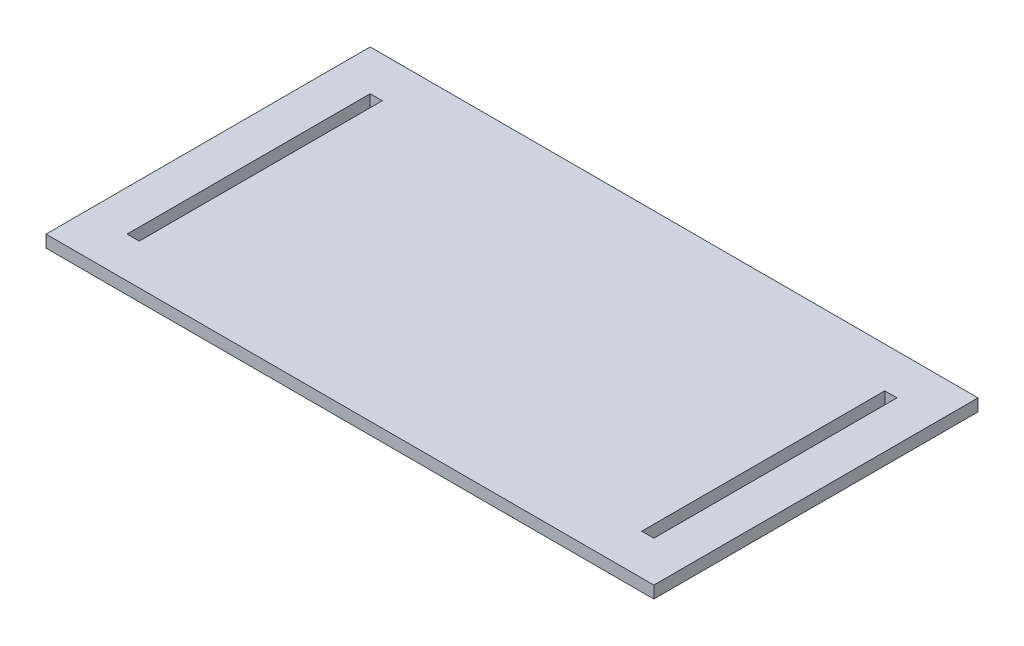
ISO-10303-21;
HEADER;
FILE_DESCRIPTION(('STEP AP214'),'2;1');
FILE_NAME('part.step','',(''),(''),'','','');
FILE_SCHEMA(('AUTOMOTIVE_DESIGN { 1 0 10303 214 1 1 1 1 }'));
ENDSEC;
DATA;
#1=APPLICATION_CONTEXT('core data for automotive mechanical design processes');
#2=APPLICATION_PROTOCOL_DEFINITION('international standard','automotive_design',2000,#1);
#3=PRODUCT_CONTEXT('',#1,'mechanical');
#4=PRODUCT('Part','Part','',(#3));
#5=PRODUCT_RELATED_PRODUCT_CATEGORY('part','',(#4));
#6=PRODUCT_DEFINITION_FORMATION('','',#4);
#7=PRODUCT_DEFINITION_CONTEXT('part definition',#1,'design');
#8=PRODUCT_DEFINITION('design','',#6,#7);
#9=PRODUCT_DEFINITION_SHAPE('','',#8);
#10=(LENGTH_UNIT() NAMED_UNIT(*) SI_UNIT(.MILLI.,.METRE.));
#11=(NAMED_UNIT(*) PLANE_ANGLE_UNIT() SI_UNIT($,.RADIAN.));
#12=(NAMED_UNIT(*) SI_UNIT($,.STERADIAN.) SOLID_ANGLE_UNIT());
#13=UNCERTAINTY_MEASURE_WITH_UNIT(LENGTH_MEASURE(1.E-05),#10,'distance_accuracy_value','');
#14=(GEOMETRIC_REPRESENTATION_CONTEXT(3) GLOBAL_UNCERTAINTY_ASSIGNED_CONTEXT((#13)) GLOBAL_UNIT_ASSIGNED_CONTEXT((#10,
#11,#12)) REPRESENTATION_CONTEXT('',''));
#15=CARTESIAN_POINT('',(0.,0.,0.));
#16=DIRECTION('',(0.,0.,1.));
#17=DIRECTION('',(1.,0.,0.));
#18=AXIS2_PLACEMENT_3D('',#15,#16,#17);
#19=CARTESIAN_POINT('',(0.,3.,0.));
#20=DIRECTION('',(0.,-1.,0.));
#21=DIRECTION('',(0.,0.,-1.));
#22=AXIS2_PLACEMENT_3D('',#19,#20,#21);
#23=PLANE('',#22);
#24=DIRECTION('',(1.,0.,0.));
#25=VECTOR('',#24,1.);
#26=CARTESIAN_POINT('',(0.,3.,-70.));
#27=LINE('',#26,#25);
#28=CARTESIAN_POINT('',(10.,3.,-70.));
#29=VERTEX_POINT('',#28);
#30=CARTESIAN_POINT('',(13.,3.,-70.));
#31=VERTEX_POINT('',#30);
#32=EDGE_CURVE('E193',#29,#31,#27,.T.);
#33=ORIENTED_EDGE('',*,*,#32,.T.);
#34=DIRECTION('',(0.,0.,1.));
#35=VECTOR('',#34,1.);
#36=CARTESIAN_POINT('',(13.,3.,0.));
#37=LINE('',#36,#35);
#38=CARTESIAN_POINT('',(13.,3.,-10.));
#39=VERTEX_POINT('',#38);
#40=EDGE_CURVE('E134',#31,#39,#37,.T.);
#41=ORIENTED_EDGE('',*,*,#40,.T.);
#42=DIRECTION('',(1.,0.,0.));
#43=VECTOR('',#42,1.);
#44=CARTESIAN_POINT('',(0.,3.,-10.));
#45=LINE('',#44,#43);
#46=CARTESIAN_POINT('',(10.,3.,-10.));
#47=VERTEX_POINT('',#46);
#48=EDGE_CURVE('E189',#47,#39,#45,.T.);
#49=ORIENTED_EDGE('',*,*,#48,.F.);
#50=DIRECTION('',(0.,0.,1.));
#51=VECTOR('',#50,1.);
#52=CARTESIAN_POINT('',(10.,3.,0.));
#53=LINE('',#52,#51);
#54=EDGE_CURVE('E191',#29,#47,#53,.T.);
#55=ORIENTED_EDGE('',*,*,#54,.F.);
#56=EDGE_LOOP('',(#33,#41,#49,#55));
#57=FACE_BOUND('',#56,.T.);
#58=DIRECTION('',(0.,0.,1.));
#59=VECTOR('',#58,1.);
#60=CARTESIAN_POINT('',(0.,3.,0.));
#61=LINE('',#60,#59);
#62=CARTESIAN_POINT('',(0.,3.,-80.));
#63=VERTEX_POINT('',#62);
#64=CARTESIAN_POINT('',(0.,3.,0.));
#65=VERTEX_POINT('',#64);
#66=EDGE_CURVE('E197',#63,#65,#61,.T.);
#67=ORIENTED_EDGE('',*,*,#66,.T.);
#68=DIRECTION('',(1.,0.,0.));
#69=VECTOR('',#68,1.);
#70=CARTESIAN_POINT('',(0.,3.,0.));
#71=LINE('',#70,#69);
#72=CARTESIAN_POINT('',(150.,3.,0.));
#73=VERTEX_POINT('',#72);
#74=EDGE_CURVE('E200',#65,#73,#71,.T.);
#75=ORIENTED_EDGE('',*,*,#74,.T.);
#76=DIRECTION('',(0.,0.,-1.));
#77=VECTOR('',#76,1.);
#78=CARTESIAN_POINT('',(150.,3.,0.));
#79=LINE('',#78,#77);
#80=CARTESIAN_POINT('',(150.,3.,-80.));
#81=VERTEX_POINT('',#80);
#82=EDGE_CURVE('E203',#73,#81,#79,.T.);
#83=ORIENTED_EDGE('',*,*,#82,.T.);
#84=DIRECTION('',(-1.,0.,0.));
#85=VECTOR('',#84,1.);
#86=CARTESIAN_POINT('',(0.,3.,-80.));
#87=LINE('',#86,#85);
#88=EDGE_CURVE('E205',#81,#63,#87,.T.);
#89=ORIENTED_EDGE('',*,*,#88,.T.);
#90=EDGE_LOOP('',(#67,#75,#83,#89));
#91=FACE_BOUND('',#90,.T.);
#92=DIRECTION('',(-1.,0.,0.));
#93=VECTOR('',#92,1.);
#94=CARTESIAN_POINT('',(0.,3.,-70.));
#95=LINE('',#94,#93);
#96=CARTESIAN_POINT('',(140.,3.,-70.));
#97=VERTEX_POINT('',#96);
#98=CARTESIAN_POINT('',(137.,3.,-70.));
#99=VERTEX_POINT('',#98);
#100=EDGE_CURVE('E187',#97,#99,#95,.T.);
#101=ORIENTED_EDGE('',*,*,#100,.F.);
#102=DIRECTION('',(0.,0.,1.));
#103=VECTOR('',#102,1.);
#104=CARTESIAN_POINT('',(140.,3.,0.));
#105=LINE('',#104,#103);
#106=CARTESIAN_POINT('',(140.,3.,-10.));
#107=VERTEX_POINT('',#106);
#108=EDGE_CURVE('E137',#97,#107,#105,.T.);
#109=ORIENTED_EDGE('',*,*,#108,.T.);
#110=DIRECTION('',(-1.,0.,0.));
#111=VECTOR('',#110,1.);
#112=CARTESIAN_POINT('',(0.,3.,-10.));
#113=LINE('',#112,#111);
#114=CARTESIAN_POINT('',(137.,3.,-10.));
#115=VERTEX_POINT('',#114);
#116=EDGE_CURVE('E182',#107,#115,#113,.T.);
#117=ORIENTED_EDGE('',*,*,#116,.T.);
#118=DIRECTION('',(0.,0.,1.));
#119=VECTOR('',#118,1.);
#120=CARTESIAN_POINT('',(137.,3.,0.));
#121=LINE('',#120,#119);
#122=EDGE_CURVE('E185',#99,#115,#121,.T.);
#123=ORIENTED_EDGE('',*,*,#122,.F.);
#124=EDGE_LOOP('',(#101,#109,#117,#123));
#125=FACE_BOUND('',#124,.T.);
#126=ADVANCED_FACE('F38',(#57,#91,#125),#23,.F.);
#127=CARTESIAN_POINT('',(0.,0.,0.));
#128=DIRECTION('',(0.,-1.,0.));
#129=DIRECTION('',(0.,0.,-1.));
#130=AXIS2_PLACEMENT_3D('',#127,#128,#129);
#131=PLANE('',#130);
#132=DIRECTION('',(0.,0.,1.));
#133=VECTOR('',#132,1.);
#134=CARTESIAN_POINT('',(13.,0.,0.));
#135=LINE('',#134,#133);
#136=CARTESIAN_POINT('',(13.,0.,-70.));
#137=VERTEX_POINT('',#136);
#138=CARTESIAN_POINT('',(13.,0.,-10.));
#139=VERTEX_POINT('',#138);
#140=EDGE_CURVE('E131',#137,#139,#135,.T.);
#141=ORIENTED_EDGE('',*,*,#140,.F.);
#142=DIRECTION('',(1.,0.,0.));
#143=VECTOR('',#142,1.);
#144=CARTESIAN_POINT('',(0.,0.,-70.));
#145=LINE('',#144,#143);
#146=CARTESIAN_POINT('',(10.,0.,-70.));
#147=VERTEX_POINT('',#146);
#148=EDGE_CURVE('E141',#147,#137,#145,.T.);
#149=ORIENTED_EDGE('',*,*,#148,.F.);
#150=DIRECTION('',(0.,0.,1.));
#151=VECTOR('',#150,1.);
#152=CARTESIAN_POINT('',(10.,0.,0.));
#153=LINE('',#152,#151);
#154=CARTESIAN_POINT('',(10.,0.,-10.));
#155=VERTEX_POINT('',#154);
#156=EDGE_CURVE('E147',#147,#155,#153,.T.);
#157=ORIENTED_EDGE('',*,*,#156,.T.);
#158=DIRECTION('',(1.,0.,0.));
#159=VECTOR('',#158,1.);
#160=CARTESIAN_POINT('',(0.,0.,-10.));
#161=LINE('',#160,#159);
#162=EDGE_CURVE('E152',#155,#139,#161,.T.);
#163=ORIENTED_EDGE('',*,*,#162,.T.);
#164=EDGE_LOOP('',(#141,#149,#157,#163));
#165=FACE_BOUND('',#164,.T.);
#166=DIRECTION('',(0.,0.,1.));
#167=VECTOR('',#166,1.);
#168=CARTESIAN_POINT('',(0.,0.,0.));
#169=LINE('',#168,#167);
#170=CARTESIAN_POINT('',(0.,0.,-80.));
#171=VERTEX_POINT('',#170);
#172=CARTESIAN_POINT('',(0.,0.,0.));
#173=VERTEX_POINT('',#172);
#174=EDGE_CURVE('E196',#171,#173,#169,.T.);
#175=ORIENTED_EDGE('',*,*,#174,.F.);
#176=DIRECTION('',(-1.,0.,0.));
#177=VECTOR('',#176,1.);
#178=CARTESIAN_POINT('',(0.,0.,-80.));
#179=LINE('',#178,#177);
#180=CARTESIAN_POINT('',(150.,0.,-80.));
#181=VERTEX_POINT('',#180);
#182=EDGE_CURVE('E201',#181,#171,#179,.T.);
#183=ORIENTED_EDGE('',*,*,#182,.F.);
#184=DIRECTION('',(0.,0.,-1.));
#185=VECTOR('',#184,1.);
#186=CARTESIAN_POINT('',(150.,0.,0.));
#187=LINE('',#186,#185);
#188=CARTESIAN_POINT('',(150.,0.,0.));
#189=VERTEX_POINT('',#188);
#190=EDGE_CURVE('E212',#189,#181,#187,.T.);
#191=ORIENTED_EDGE('',*,*,#190,.F.);
#192=DIRECTION('',(1.,0.,0.));
#193=VECTOR('',#192,1.);
#194=CARTESIAN_POINT('',(0.,0.,0.));
#195=LINE('',#194,#193);
#196=EDGE_CURVE('E210',#173,#189,#195,.T.);
#197=ORIENTED_EDGE('',*,*,#196,.F.);
#198=EDGE_LOOP('',(#175,#183,#191,#197));
#199=FACE_BOUND('',#198,.T.);
#200=DIRECTION('',(0.,0.,1.));
#201=VECTOR('',#200,1.);
#202=CARTESIAN_POINT('',(140.,0.,0.));
#203=LINE('',#202,#201);
#204=CARTESIAN_POINT('',(140.,0.,-70.));
#205=VERTEX_POINT('',#204);
#206=CARTESIAN_POINT('',(140.,0.,-10.));
#207=VERTEX_POINT('',#206);
#208=EDGE_CURVE('E173',#205,#207,#203,.T.);
#209=ORIENTED_EDGE('',*,*,#208,.F.);
#210=DIRECTION('',(-1.,0.,0.));
#211=VECTOR('',#210,1.);
#212=CARTESIAN_POINT('',(0.,0.,-70.));
#213=LINE('',#212,#211);
#214=CARTESIAN_POINT('',(137.,0.,-70.));
#215=VERTEX_POINT('',#214);
#216=EDGE_CURVE('E164',#205,#215,#213,.T.);
#217=ORIENTED_EDGE('',*,*,#216,.T.);
#218=DIRECTION('',(0.,0.,1.));
#219=VECTOR('',#218,1.);
#220=CARTESIAN_POINT('',(137.,0.,0.));
#221=LINE('',#220,#219);
#222=CARTESIAN_POINT('',(137.,0.,-10.));
#223=VERTEX_POINT('',#222);
#224=EDGE_CURVE('E167',#215,#223,#221,.T.);
#225=ORIENTED_EDGE('',*,*,#224,.T.);
#226=DIRECTION('',(-1.,0.,0.));
#227=VECTOR('',#226,1.);
#228=CARTESIAN_POINT('',(0.,0.,-10.));
#229=LINE('',#228,#227);
#230=EDGE_CURVE('E170',#207,#223,#229,.T.);
#231=ORIENTED_EDGE('',*,*,#230,.F.);
#232=EDGE_LOOP('',(#209,#217,#225,#231));
#233=FACE_BOUND('',#232,.T.);
#234=ADVANCED_FACE('F150',(#165,#199,#233),#131,.T.);
#235=CARTESIAN_POINT('',(0.,3.,0.));
#236=DIRECTION('',(1.,0.,0.));
#237=DIRECTION('',(0.,0.,-1.));
#238=AXIS2_PLACEMENT_3D('',#235,#236,#237);
#239=PLANE('',#238);
#240=ORIENTED_EDGE('',*,*,#174,.T.);
#241=DIRECTION('',(0.,-1.,0.));
#242=VECTOR('',#241,1.);
#243=CARTESIAN_POINT('',(0.,3.,0.));
#244=LINE('',#243,#242);
#245=EDGE_CURVE('E11',#65,#173,#244,.T.);
#246=ORIENTED_EDGE('',*,*,#245,.F.);
#247=ORIENTED_EDGE('',*,*,#66,.F.);
#248=DIRECTION('',(0.,-1.,0.));
#249=VECTOR('',#248,1.);
#250=CARTESIAN_POINT('',(0.,3.,-80.));
#251=LINE('',#250,#249);
#252=EDGE_CURVE('E207',#63,#171,#251,.T.);
#253=ORIENTED_EDGE('',*,*,#252,.T.);
#254=EDGE_LOOP('',(#240,#246,#247,#253));
#255=FACE_BOUND('',#254,.T.);
#256=ADVANCED_FACE('F40',(#255),#239,.F.);
#257=CARTESIAN_POINT('',(0.,3.,0.));
#258=DIRECTION('',(0.,0.,-1.));
#259=DIRECTION('',(-1.,0.,0.));
#260=AXIS2_PLACEMENT_3D('',#257,#258,#259);
#261=PLANE('',#260);
#262=ORIENTED_EDGE('',*,*,#196,.T.);
#263=DIRECTION('',(0.,-1.,0.));
#264=VECTOR('',#263,1.);
#265=CARTESIAN_POINT('',(150.,3.,0.));
#266=LINE('',#265,#264);
#267=EDGE_CURVE('E46',#73,#189,#266,.T.);
#268=ORIENTED_EDGE('',*,*,#267,.F.);
#269=ORIENTED_EDGE('',*,*,#74,.F.);
#270=ORIENTED_EDGE('',*,*,#245,.T.);
#271=EDGE_LOOP('',(#262,#268,#269,#270));
#272=FACE_BOUND('',#271,.T.);
#273=ADVANCED_FACE('F239',(#272),#261,.F.);
#274=CARTESIAN_POINT('',(150.,3.,0.));
#275=DIRECTION('',(-1.,0.,0.));
#276=DIRECTION('',(0.,0.,1.));
#277=AXIS2_PLACEMENT_3D('',#274,#275,#276);
#278=PLANE('',#277);
#279=ORIENTED_EDGE('',*,*,#190,.T.);
#280=DIRECTION('',(0.,-1.,0.));
#281=VECTOR('',#280,1.);
#282=CARTESIAN_POINT('',(150.,3.,-80.));
#283=LINE('',#282,#281);
#284=EDGE_CURVE('E217',#81,#181,#283,.T.);
#285=ORIENTED_EDGE('',*,*,#284,.F.);
#286=ORIENTED_EDGE('',*,*,#82,.F.);
#287=ORIENTED_EDGE('',*,*,#267,.T.);
#288=EDGE_LOOP('',(#279,#285,#286,#287));
#289=FACE_BOUND('',#288,.T.);
#290=ADVANCED_FACE('F224',(#289),#278,.F.);
#291=CARTESIAN_POINT('',(0.,3.,-80.));
#292=DIRECTION('',(0.,0.,1.));
#293=DIRECTION('',(1.,0.,0.));
#294=AXIS2_PLACEMENT_3D('',#291,#292,#293);
#295=PLANE('',#294);
#296=ORIENTED_EDGE('',*,*,#182,.T.);
#297=ORIENTED_EDGE('',*,*,#252,.F.);
#298=ORIENTED_EDGE('',*,*,#88,.F.);
#299=ORIENTED_EDGE('',*,*,#284,.T.);
#300=EDGE_LOOP('',(#296,#297,#298,#299));
#301=FACE_BOUND('',#300,.T.);
#302=ADVANCED_FACE('F232',(#301),#295,.F.);
#303=CARTESIAN_POINT('',(0.,10.,-70.));
#304=DIRECTION('',(0.,0.,1.));
#305=DIRECTION('',(1.,0.,0.));
#306=AXIS2_PLACEMENT_3D('',#303,#304,#305);
#307=PLANE('',#306);
#308=ORIENTED_EDGE('',*,*,#100,.T.);
#309=DIRECTION('',(0.,-1.,0.));
#310=VECTOR('',#309,1.);
#311=CARTESIAN_POINT('',(137.,10.,-70.));
#312=LINE('',#311,#310);
#313=EDGE_CURVE('E153',#99,#215,#312,.T.);
#314=ORIENTED_EDGE('',*,*,#313,.T.);
#315=ORIENTED_EDGE('',*,*,#216,.F.);
#316=DIRECTION('',(0.,-1.,0.));
#317=VECTOR('',#316,1.);
#318=CARTESIAN_POINT('',(140.,10.,-70.));
#319=LINE('',#318,#317);
#320=EDGE_CURVE('E175',#97,#205,#319,.T.);
#321=ORIENTED_EDGE('',*,*,#320,.F.);
#322=EDGE_LOOP('',(#308,#314,#315,#321));
#323=FACE_BOUND('',#322,.T.);
#324=ADVANCED_FACE('F255',(#323),#307,.T.);
#325=CARTESIAN_POINT('',(137.,10.,0.));
#326=DIRECTION('',(1.,0.,0.));
#327=DIRECTION('',(0.,0.,-1.));
#328=AXIS2_PLACEMENT_3D('',#325,#326,#327);
#329=PLANE('',#328);
#330=ORIENTED_EDGE('',*,*,#122,.T.);
#331=DIRECTION('',(0.,-1.,0.));
#332=VECTOR('',#331,1.);
#333=CARTESIAN_POINT('',(137.,10.,-10.));
#334=LINE('',#333,#332);
#335=EDGE_CURVE('E155',#115,#223,#334,.T.);
#336=ORIENTED_EDGE('',*,*,#335,.T.);
#337=ORIENTED_EDGE('',*,*,#224,.F.);
#338=ORIENTED_EDGE('',*,*,#313,.F.);
#339=EDGE_LOOP('',(#330,#336,#337,#338));
#340=FACE_BOUND('',#339,.T.);
#341=ADVANCED_FACE('F262',(#340),#329,.T.);
#342=CARTESIAN_POINT('',(0.,10.,-10.));
#343=DIRECTION('',(0.,0.,1.));
#344=DIRECTION('',(1.,0.,0.));
#345=AXIS2_PLACEMENT_3D('',#342,#343,#344);
#346=PLANE('',#345);
#347=DIRECTION('',(0.,-1.,0.));
#348=VECTOR('',#347,1.);
#349=CARTESIAN_POINT('',(140.,10.,-10.));
#350=LINE('',#349,#348);
#351=EDGE_CURVE('E61',#107,#207,#350,.T.);
#352=ORIENTED_EDGE('',*,*,#351,.T.);
#353=ORIENTED_EDGE('',*,*,#230,.T.);
#354=ORIENTED_EDGE('',*,*,#335,.F.);
#355=ORIENTED_EDGE('',*,*,#116,.F.);
#356=EDGE_LOOP('',(#352,#353,#354,#355));
#357=FACE_BOUND('',#356,.T.);
#358=ADVANCED_FACE('F268',(#357),#346,.F.);
#359=CARTESIAN_POINT('',(140.,10.,0.));
#360=DIRECTION('',(1.,0.,0.));
#361=DIRECTION('',(0.,0.,-1.));
#362=AXIS2_PLACEMENT_3D('',#359,#360,#361);
#363=PLANE('',#362);
#364=ORIENTED_EDGE('',*,*,#320,.T.);
#365=ORIENTED_EDGE('',*,*,#208,.T.);
#366=ORIENTED_EDGE('',*,*,#351,.F.);
#367=ORIENTED_EDGE('',*,*,#108,.F.);
#368=EDGE_LOOP('',(#364,#365,#366,#367));
#369=FACE_BOUND('',#368,.T.);
#370=ADVANCED_FACE('F279',(#369),#363,.F.);
#371=CARTESIAN_POINT('',(13.,10.,0.));
#372=DIRECTION('',(1.,0.,0.));
#373=DIRECTION('',(0.,0.,-1.));
#374=AXIS2_PLACEMENT_3D('',#371,#372,#373);
#375=PLANE('',#374);
#376=DIRECTION('',(0.,-1.,0.));
#377=VECTOR('',#376,1.);
#378=CARTESIAN_POINT('',(13.,10.,-70.));
#379=LINE('',#378,#377);
#380=EDGE_CURVE('E126',#31,#137,#379,.T.);
#381=ORIENTED_EDGE('',*,*,#380,.T.);
#382=ORIENTED_EDGE('',*,*,#140,.T.);
#383=DIRECTION('',(0.,-1.,0.));
#384=VECTOR('',#383,1.);
#385=CARTESIAN_POINT('',(13.,10.,-10.));
#386=LINE('',#385,#384);
#387=EDGE_CURVE('E160',#39,#139,#386,.T.);
#388=ORIENTED_EDGE('',*,*,#387,.F.);
#389=ORIENTED_EDGE('',*,*,#40,.F.);
#390=EDGE_LOOP('',(#381,#382,#388,#389));
#391=FACE_BOUND('',#390,.T.);
#392=ADVANCED_FACE('F128',(#391),#375,.F.);
#393=CARTESIAN_POINT('',(0.,10.,-70.));
#394=DIRECTION('',(0.,0.,-1.));
#395=DIRECTION('',(-1.,0.,0.));
#396=AXIS2_PLACEMENT_3D('',#393,#394,#395);
#397=PLANE('',#396);
#398=DIRECTION('',(0.,-1.,0.));
#399=VECTOR('',#398,1.);
#400=CARTESIAN_POINT('',(10.,10.,-70.));
#401=LINE('',#400,#399);
#402=EDGE_CURVE('E138',#29,#147,#401,.T.);
#403=ORIENTED_EDGE('',*,*,#402,.T.);
#404=ORIENTED_EDGE('',*,*,#148,.T.);
#405=ORIENTED_EDGE('',*,*,#380,.F.);
#406=ORIENTED_EDGE('',*,*,#32,.F.);
#407=EDGE_LOOP('',(#403,#404,#405,#406));
#408=FACE_BOUND('',#407,.T.);
#409=ADVANCED_FACE('F142',(#408),#397,.F.);
#410=CARTESIAN_POINT('',(10.,10.,0.));
#411=DIRECTION('',(1.,0.,0.));
#412=DIRECTION('',(0.,0.,-1.));
#413=AXIS2_PLACEMENT_3D('',#410,#411,#412);
#414=PLANE('',#413);
#415=ORIENTED_EDGE('',*,*,#54,.T.);
#416=DIRECTION('',(0.,-1.,0.));
#417=VECTOR('',#416,1.);
#418=CARTESIAN_POINT('',(10.,10.,-10.));
#419=LINE('',#418,#417);
#420=EDGE_CURVE('E53',#47,#155,#419,.T.);
#421=ORIENTED_EDGE('',*,*,#420,.T.);
#422=ORIENTED_EDGE('',*,*,#156,.F.);
#423=ORIENTED_EDGE('',*,*,#402,.F.);
#424=EDGE_LOOP('',(#415,#421,#422,#423));
#425=FACE_BOUND('',#424,.T.);
#426=ADVANCED_FACE('F291',(#425),#414,.T.);
#427=CARTESIAN_POINT('',(0.,10.,-10.));
#428=DIRECTION('',(0.,0.,-1.));
#429=DIRECTION('',(-1.,0.,0.));
#430=AXIS2_PLACEMENT_3D('',#427,#428,#429);
#431=PLANE('',#430);
#432=ORIENTED_EDGE('',*,*,#48,.T.);
#433=ORIENTED_EDGE('',*,*,#387,.T.);
#434=ORIENTED_EDGE('',*,*,#162,.F.);
#435=ORIENTED_EDGE('',*,*,#420,.F.);
#436=EDGE_LOOP('',(#432,#433,#434,#435));
#437=FACE_BOUND('',#436,.T.);
#438=ADVANCED_FACE('F294',(#437),#431,.T.);
#439=CLOSED_SHELL('',(#126,#234,#256,#273,#290,#302,#324,#341,#358,#370,#392,#409,#426,#438));
#440=MANIFOLD_SOLID_BREP('B2',#439);
#441=ADVANCED_BREP_SHAPE_REPRESENTATION('',(#18,#440),#14);
#442=SHAPE_DEFINITION_REPRESENTATION(#9,#441);
ENDSEC;
END-ISO-10303-21;
